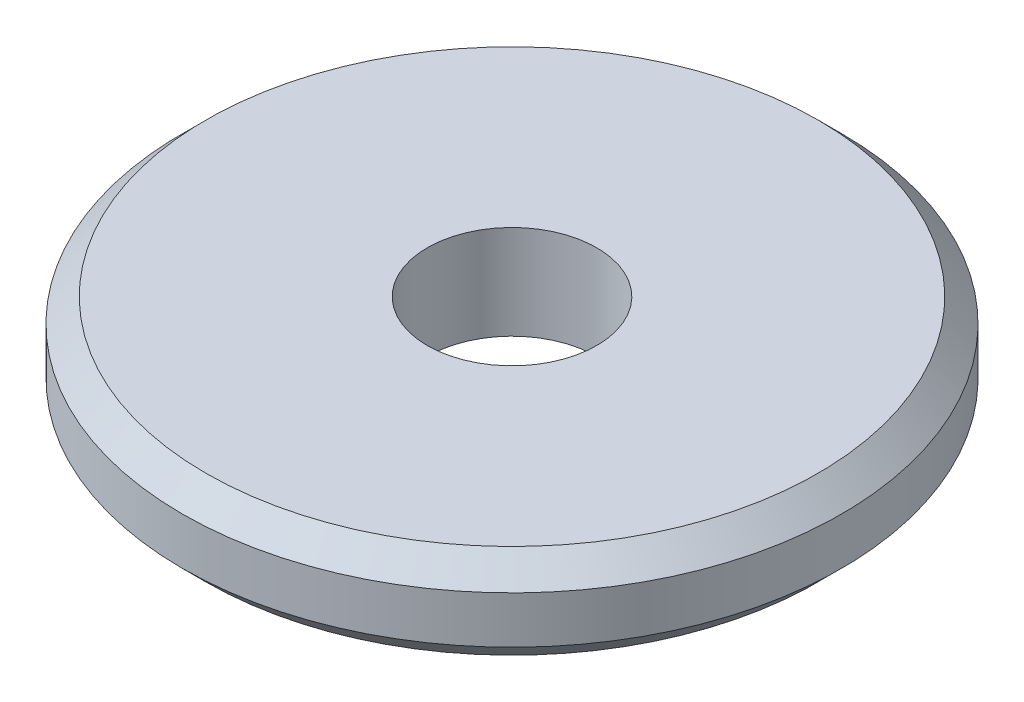
ISO-10303-21;
HEADER;
FILE_DESCRIPTION(('STEP AP214'),'2;1');
FILE_NAME('part.step','',(''),(''),'','','');
FILE_SCHEMA(('AUTOMOTIVE_DESIGN { 1 0 10303 214 1 1 1 1 }'));
ENDSEC;
DATA;
#1=APPLICATION_CONTEXT('core data for automotive mechanical design processes');
#2=APPLICATION_PROTOCOL_DEFINITION('international standard','automotive_design',2000,#1);
#3=PRODUCT_CONTEXT('',#1,'mechanical');
#4=PRODUCT('Part','Part','',(#3));
#5=PRODUCT_RELATED_PRODUCT_CATEGORY('part','',(#4));
#6=PRODUCT_DEFINITION_FORMATION('','',#4);
#7=PRODUCT_DEFINITION_CONTEXT('part definition',#1,'design');
#8=PRODUCT_DEFINITION('design','',#6,#7);
#9=PRODUCT_DEFINITION_SHAPE('','',#8);
#10=(LENGTH_UNIT() NAMED_UNIT(*) SI_UNIT(.MILLI.,.METRE.));
#11=(NAMED_UNIT(*) PLANE_ANGLE_UNIT() SI_UNIT($,.RADIAN.));
#12=(NAMED_UNIT(*) SI_UNIT($,.STERADIAN.) SOLID_ANGLE_UNIT());
#13=UNCERTAINTY_MEASURE_WITH_UNIT(LENGTH_MEASURE(1.E-05),#10,'distance_accuracy_value','');
#14=(GEOMETRIC_REPRESENTATION_CONTEXT(3) GLOBAL_UNCERTAINTY_ASSIGNED_CONTEXT((#13)) GLOBAL_UNIT_ASSIGNED_CONTEXT((#10,
#11,#12)) REPRESENTATION_CONTEXT('',''));
#15=CARTESIAN_POINT('',(0.,0.,0.));
#16=DIRECTION('',(0.,0.,1.));
#17=DIRECTION('',(1.,0.,0.));
#18=AXIS2_PLACEMENT_3D('',#15,#16,#17);
#19=CARTESIAN_POINT('',(0.,2.,0.));
#20=DIRECTION('',(0.,1.,0.));
#21=DIRECTION('',(0.,0.,1.));
#22=AXIS2_PLACEMENT_3D('',#19,#20,#21);
#23=PLANE('',#22);
#24=CARTESIAN_POINT('',(0.,2.,0.));
#25=DIRECTION('',(0.,1.,0.));
#26=DIRECTION('',(0.,0.,1.));
#27=AXIS2_PLACEMENT_3D('',#24,#25,#26);
#28=CIRCLE('',#27,6.5);
#29=CARTESIAN_POINT('',(0.,2.,6.5));
#30=VERTEX_POINT('',#29);
#31=EDGE_CURVE('E10',#30,#30,#28,.T.);
#32=ORIENTED_EDGE('',*,*,#31,.T.);
#33=EDGE_LOOP('',(#32));
#34=FACE_BOUND('',#33,.T.);
#35=CARTESIAN_POINT('',(0.,2.,0.));
#36=DIRECTION('',(0.,1.,0.));
#37=DIRECTION('',(0.,0.,1.));
#38=AXIS2_PLACEMENT_3D('',#35,#36,#37);
#39=CIRCLE('',#38,1.8);
#40=CARTESIAN_POINT('',(0.,2.,1.8));
#41=VERTEX_POINT('',#40);
#42=EDGE_CURVE('E62',#41,#41,#39,.T.);
#43=ORIENTED_EDGE('',*,*,#42,.F.);
#44=EDGE_LOOP('',(#43));
#45=FACE_BOUND('',#44,.T.);
#46=ADVANCED_FACE('F41',(#34,#45),#23,.T.);
#47=CARTESIAN_POINT('',(0.,0.,0.));
#48=DIRECTION('',(0.,1.,0.));
#49=DIRECTION('',(0.,0.,1.));
#50=AXIS2_PLACEMENT_3D('',#47,#48,#49);
#51=PLANE('',#50);
#52=CARTESIAN_POINT('',(0.,0.,0.));
#53=DIRECTION('',(0.,1.,0.));
#54=DIRECTION('',(0.,0.,1.));
#55=AXIS2_PLACEMENT_3D('',#52,#53,#54);
#56=CIRCLE('',#55,6.5);
#57=CARTESIAN_POINT('',(0.,0.,6.5));
#58=VERTEX_POINT('',#57);
#59=EDGE_CURVE('E49',#58,#58,#56,.F.);
#60=ORIENTED_EDGE('',*,*,#59,.T.);
#61=EDGE_LOOP('',(#60));
#62=FACE_BOUND('',#61,.T.);
#63=CARTESIAN_POINT('',(0.,0.,0.));
#64=DIRECTION('',(0.,1.,0.));
#65=DIRECTION('',(0.,0.,1.));
#66=AXIS2_PLACEMENT_3D('',#63,#64,#65);
#67=CIRCLE('',#66,1.8);
#68=CARTESIAN_POINT('',(0.,0.,1.8));
#69=VERTEX_POINT('',#68);
#70=EDGE_CURVE('E63',#69,#69,#67,.T.);
#71=ORIENTED_EDGE('',*,*,#70,.T.);
#72=EDGE_LOOP('',(#71));
#73=FACE_BOUND('',#72,.T.);
#74=ADVANCED_FACE('F73',(#62,#73),#51,.F.);
#75=CARTESIAN_POINT('',(0.,2.,0.));
#76=DIRECTION('',(0.,-1.,0.));
#77=DIRECTION('',(0.,0.,-1.));
#78=AXIS2_PLACEMENT_3D('',#75,#76,#77);
#79=CYLINDRICAL_SURFACE('',#78,7.);
#80=CARTESIAN_POINT('',(0.,0.499999999999998,0.));
#81=DIRECTION('',(0.,1.,0.));
#82=DIRECTION('',(0.,0.,1.));
#83=AXIS2_PLACEMENT_3D('',#80,#81,#82);
#84=CIRCLE('',#83,7.);
#85=CARTESIAN_POINT('',(0.,0.499999999999998,7.));
#86=VERTEX_POINT('',#85);
#87=EDGE_CURVE('E53',#86,#86,#84,.T.);
#88=ORIENTED_EDGE('',*,*,#87,.T.);
#89=EDGE_LOOP('',(#88));
#90=FACE_BOUND('',#89,.T.);
#91=CARTESIAN_POINT('',(0.,1.5,0.));
#92=DIRECTION('',(0.,1.,0.));
#93=DIRECTION('',(0.,0.,1.));
#94=AXIS2_PLACEMENT_3D('',#91,#92,#93);
#95=CIRCLE('',#94,7.);
#96=CARTESIAN_POINT('',(0.,1.5,7.));
#97=VERTEX_POINT('',#96);
#98=EDGE_CURVE('E57',#97,#97,#95,.F.);
#99=ORIENTED_EDGE('',*,*,#98,.T.);
#100=EDGE_LOOP('',(#99));
#101=FACE_BOUND('',#100,.T.);
#102=ADVANCED_FACE('F79',(#90,#101),#79,.T.);
#103=CARTESIAN_POINT('',(0.,2.,0.));
#104=DIRECTION('',(0.,-1.,0.));
#105=DIRECTION('',(0.,0.,-1.));
#106=AXIS2_PLACEMENT_3D('',#103,#104,#105);
#107=CYLINDRICAL_SURFACE('',#106,1.8);
#108=ORIENTED_EDGE('',*,*,#42,.T.);
#109=EDGE_LOOP('',(#108));
#110=FACE_BOUND('',#109,.T.);
#111=ORIENTED_EDGE('',*,*,#70,.F.);
#112=EDGE_LOOP('',(#111));
#113=FACE_BOUND('',#112,.T.);
#114=ADVANCED_FACE('F69',(#110,#113),#107,.F.);
#115=CARTESIAN_POINT('',(0.,0.499999999999998,0.));
#116=DIRECTION('',(0.,1.,0.));
#117=DIRECTION('',(0.,0.,1.));
#118=AXIS2_PLACEMENT_3D('',#115,#116,#117);
#119=CONICAL_SURFACE('',#118,7.,0.78539816339745);
#120=ORIENTED_EDGE('',*,*,#59,.F.);
#121=EDGE_LOOP('',(#120));
#122=FACE_BOUND('',#121,.T.);
#123=ORIENTED_EDGE('',*,*,#87,.F.);
#124=EDGE_LOOP('',(#123));
#125=FACE_BOUND('',#124,.T.);
#126=ADVANCED_FACE('F86',(#122,#125),#119,.T.);
#127=CARTESIAN_POINT('',(0.,2.,0.));
#128=DIRECTION('',(0.,-1.,0.));
#129=DIRECTION('',(0.,0.,-1.));
#130=AXIS2_PLACEMENT_3D('',#127,#128,#129);
#131=CONICAL_SURFACE('',#130,6.5,0.785398163397447);
#132=ORIENTED_EDGE('',*,*,#98,.F.);
#133=EDGE_LOOP('',(#132));
#134=FACE_BOUND('',#133,.T.);
#135=ORIENTED_EDGE('',*,*,#31,.F.);
#136=EDGE_LOOP('',(#135));
#137=FACE_BOUND('',#136,.T.);
#138=ADVANCED_FACE('F44',(#134,#137),#131,.T.);
#139=CLOSED_SHELL('',(#46,#74,#102,#114,#126,#138));
#140=MANIFOLD_SOLID_BREP('B2',#139);
#141=ADVANCED_BREP_SHAPE_REPRESENTATION('',(#18,#140),#14);
#142=SHAPE_DEFINITION_REPRESENTATION(#9,#141);
ENDSEC;
END-ISO-10303-21;
